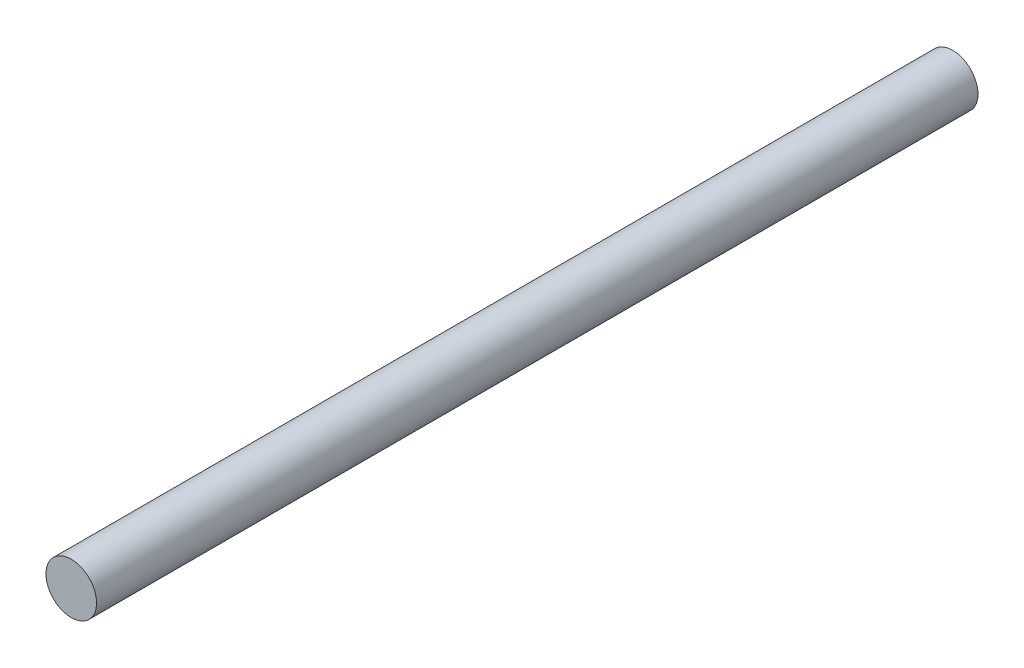
ISO-10303-21;
HEADER;
FILE_DESCRIPTION(('STEP AP214'),'2;1');
FILE_NAME('part.step','',(''),(''),'','','');
FILE_SCHEMA(('AUTOMOTIVE_DESIGN { 1 0 10303 214 1 1 1 1 }'));
ENDSEC;
DATA;
#1=APPLICATION_CONTEXT('core data for automotive mechanical design processes');
#2=APPLICATION_PROTOCOL_DEFINITION('international standard','automotive_design',2000,#1);
#3=PRODUCT_CONTEXT('',#1,'mechanical');
#4=PRODUCT('Part','Part','',(#3));
#5=PRODUCT_RELATED_PRODUCT_CATEGORY('part','',(#4));
#6=PRODUCT_DEFINITION_FORMATION('','',#4);
#7=PRODUCT_DEFINITION_CONTEXT('part definition',#1,'design');
#8=PRODUCT_DEFINITION('design','',#6,#7);
#9=PRODUCT_DEFINITION_SHAPE('','',#8);
#10=(LENGTH_UNIT() NAMED_UNIT(*) SI_UNIT(.MILLI.,.METRE.));
#11=(NAMED_UNIT(*) PLANE_ANGLE_UNIT() SI_UNIT($,.RADIAN.));
#12=(NAMED_UNIT(*) SI_UNIT($,.STERADIAN.) SOLID_ANGLE_UNIT());
#13=UNCERTAINTY_MEASURE_WITH_UNIT(LENGTH_MEASURE(1.E-05),#10,'distance_accuracy_value','');
#14=(GEOMETRIC_REPRESENTATION_CONTEXT(3) GLOBAL_UNCERTAINTY_ASSIGNED_CONTEXT((#13)) GLOBAL_UNIT_ASSIGNED_CONTEXT((#10,
#11,#12)) REPRESENTATION_CONTEXT('',''));
#15=CARTESIAN_POINT('',(0.,0.,0.));
#16=DIRECTION('',(0.,0.,1.));
#17=DIRECTION('',(1.,0.,0.));
#18=AXIS2_PLACEMENT_3D('',#15,#16,#17);
#19=CARTESIAN_POINT('',(0.,0.,104.5));
#20=DIRECTION('',(0.,0.,-1.));
#21=DIRECTION('',(-1.,0.,0.));
#22=AXIS2_PLACEMENT_3D('',#19,#20,#21);
#23=CYLINDRICAL_SURFACE('',#22,3.);
#24=CARTESIAN_POINT('',(0.,0.,104.5));
#25=DIRECTION('',(0.,0.,1.));
#26=DIRECTION('',(1.,0.,0.));
#27=AXIS2_PLACEMENT_3D('',#24,#25,#26);
#28=CIRCLE('',#27,3.);
#29=CARTESIAN_POINT('',(3.,0.,104.5));
#30=VERTEX_POINT('',#29);
#31=EDGE_CURVE('E10',#30,#30,#28,.T.);
#32=ORIENTED_EDGE('',*,*,#31,.F.);
#33=EDGE_LOOP('',(#32));
#34=FACE_BOUND('',#33,.T.);
#35=CARTESIAN_POINT('',(0.,0.,0.));
#36=DIRECTION('',(0.,0.,1.));
#37=DIRECTION('',(1.,0.,0.));
#38=AXIS2_PLACEMENT_3D('',#35,#36,#37);
#39=CIRCLE('',#38,3.);
#40=CARTESIAN_POINT('',(3.,0.,0.));
#41=VERTEX_POINT('',#40);
#42=EDGE_CURVE('E34',#41,#41,#39,.T.);
#43=ORIENTED_EDGE('',*,*,#42,.T.);
#44=EDGE_LOOP('',(#43));
#45=FACE_BOUND('',#44,.T.);
#46=ADVANCED_FACE('F31',(#34,#45),#23,.T.);
#47=CARTESIAN_POINT('',(0.,0.,104.5));
#48=DIRECTION('',(0.,0.,1.));
#49=DIRECTION('',(1.,0.,0.));
#50=AXIS2_PLACEMENT_3D('',#47,#48,#49);
#51=PLANE('',#50);
#52=ORIENTED_EDGE('',*,*,#31,.T.);
#53=EDGE_LOOP('',(#52));
#54=FACE_BOUND('',#53,.T.);
#55=ADVANCED_FACE('F46',(#54),#51,.T.);
#56=CARTESIAN_POINT('',(0.,0.,0.));
#57=DIRECTION('',(0.,0.,1.));
#58=DIRECTION('',(1.,0.,0.));
#59=AXIS2_PLACEMENT_3D('',#56,#57,#58);
#60=PLANE('',#59);
#61=ORIENTED_EDGE('',*,*,#42,.F.);
#62=EDGE_LOOP('',(#61));
#63=FACE_BOUND('',#62,.T.);
#64=ADVANCED_FACE('F44',(#63),#60,.F.);
#65=CLOSED_SHELL('',(#46,#55,#64));
#66=MANIFOLD_SOLID_BREP('B2',#65);
#67=ADVANCED_BREP_SHAPE_REPRESENTATION('',(#18,#66),#14);
#68=SHAPE_DEFINITION_REPRESENTATION(#9,#67);
ENDSEC;
END-ISO-10303-21;
